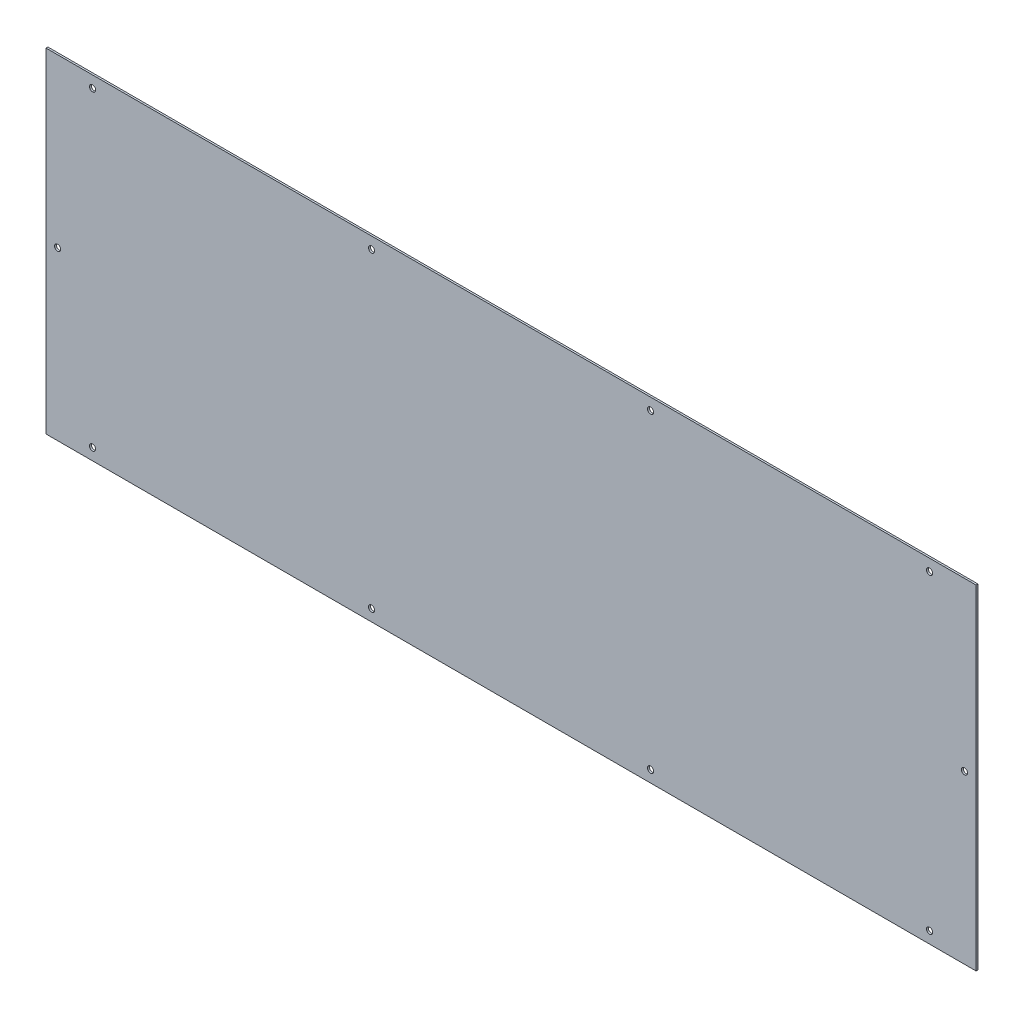
ISO-10303-21;
HEADER;
FILE_DESCRIPTION(('STEP AP214'),'2;1');
FILE_NAME('part.step','',(''),(''),'','','');
FILE_SCHEMA(('AUTOMOTIVE_DESIGN { 1 0 10303 214 1 1 1 1 }'));
ENDSEC;
DATA;
#1=APPLICATION_CONTEXT('core data for automotive mechanical design processes');
#2=APPLICATION_PROTOCOL_DEFINITION('international standard','automotive_design',2000,#1);
#3=PRODUCT_CONTEXT('',#1,'mechanical');
#4=PRODUCT('Part','Part','',(#3));
#5=PRODUCT_RELATED_PRODUCT_CATEGORY('part','',(#4));
#6=PRODUCT_DEFINITION_FORMATION('','',#4);
#7=PRODUCT_DEFINITION_CONTEXT('part definition',#1,'design');
#8=PRODUCT_DEFINITION('design','',#6,#7);
#9=PRODUCT_DEFINITION_SHAPE('','',#8);
#10=(LENGTH_UNIT() NAMED_UNIT(*) SI_UNIT(.MILLI.,.METRE.));
#11=(NAMED_UNIT(*) PLANE_ANGLE_UNIT() SI_UNIT($,.RADIAN.));
#12=(NAMED_UNIT(*) SI_UNIT($,.STERADIAN.) SOLID_ANGLE_UNIT());
#13=UNCERTAINTY_MEASURE_WITH_UNIT(LENGTH_MEASURE(1.E-05),#10,'distance_accuracy_value','');
#14=(GEOMETRIC_REPRESENTATION_CONTEXT(3) GLOBAL_UNCERTAINTY_ASSIGNED_CONTEXT((#13)) GLOBAL_UNIT_ASSIGNED_CONTEXT((#10,
#11,#12)) REPRESENTATION_CONTEXT('',''));
#15=CARTESIAN_POINT('',(0.,0.,0.));
#16=DIRECTION('',(0.,0.,1.));
#17=DIRECTION('',(1.,0.,0.));
#18=AXIS2_PLACEMENT_3D('',#15,#16,#17);
#19=CARTESIAN_POINT('',(0.,0.,2.));
#20=DIRECTION('',(0.,0.,-1.));
#21=DIRECTION('',(-1.,0.,0.));
#22=AXIS2_PLACEMENT_3D('',#19,#20,#21);
#23=PLANE('',#22);
#24=CARTESIAN_POINT('',(487.,0.,2.));
#25=DIRECTION('',(0.,0.,1.));
#26=DIRECTION('',(1.,0.,0.));
#27=AXIS2_PLACEMENT_3D('',#24,#25,#26);
#28=CIRCLE('',#27,3.29999999999997);
#29=CARTESIAN_POINT('',(490.3,0.,2.));
#30=VERTEX_POINT('',#29);
#31=EDGE_CURVE('E369',#30,#30,#28,.T.);
#32=ORIENTED_EDGE('',*,*,#31,.F.);
#33=EDGE_LOOP('',(#32));
#34=FACE_BOUND('',#33,.T.);
#35=CARTESIAN_POINT('',(-487.,0.,2.));
#36=DIRECTION('',(0.,0.,1.));
#37=DIRECTION('',(1.,0.,0.));
#38=AXIS2_PLACEMENT_3D('',#35,#36,#37);
#39=CIRCLE('',#38,3.29999999999997);
#40=CARTESIAN_POINT('',(-483.7,0.,2.));
#41=VERTEX_POINT('',#40);
#42=EDGE_CURVE('E145',#41,#41,#39,.T.);
#43=ORIENTED_EDGE('',*,*,#42,.F.);
#44=EDGE_LOOP('',(#43));
#45=FACE_BOUND('',#44,.T.);
#46=CARTESIAN_POINT('',(149.833333333333,-167.,2.));
#47=DIRECTION('',(0.,0.,1.));
#48=DIRECTION('',(1.,0.,0.));
#49=AXIS2_PLACEMENT_3D('',#46,#47,#48);
#50=CIRCLE('',#49,3.3);
#51=CARTESIAN_POINT('',(153.133333333333,-167.,2.));
#52=VERTEX_POINT('',#51);
#53=EDGE_CURVE('E142',#52,#52,#50,.T.);
#54=ORIENTED_EDGE('',*,*,#53,.F.);
#55=EDGE_LOOP('',(#54));
#56=FACE_BOUND('',#55,.T.);
#57=CARTESIAN_POINT('',(-149.833333333333,-167.,2.));
#58=DIRECTION('',(0.,0.,1.));
#59=DIRECTION('',(1.,0.,0.));
#60=AXIS2_PLACEMENT_3D('',#57,#58,#59);
#61=CIRCLE('',#60,3.3);
#62=CARTESIAN_POINT('',(-146.533333333333,-167.,2.));
#63=VERTEX_POINT('',#62);
#64=EDGE_CURVE('E154',#63,#63,#61,.T.);
#65=ORIENTED_EDGE('',*,*,#64,.F.);
#66=EDGE_LOOP('',(#65));
#67=FACE_BOUND('',#66,.T.);
#68=CARTESIAN_POINT('',(-449.5,-167.,2.));
#69=DIRECTION('',(0.,0.,1.));
#70=DIRECTION('',(1.,0.,0.));
#71=AXIS2_PLACEMENT_3D('',#68,#69,#70);
#72=CIRCLE('',#71,3.29999999999997);
#73=CARTESIAN_POINT('',(-446.2,-167.,2.));
#74=VERTEX_POINT('',#73);
#75=EDGE_CURVE('E160',#74,#74,#72,.T.);
#76=ORIENTED_EDGE('',*,*,#75,.F.);
#77=EDGE_LOOP('',(#76));
#78=FACE_BOUND('',#77,.T.);
#79=CARTESIAN_POINT('',(-149.833333333333,167.,2.));
#80=DIRECTION('',(0.,0.,1.));
#81=DIRECTION('',(1.,0.,0.));
#82=AXIS2_PLACEMENT_3D('',#79,#80,#81);
#83=CIRCLE('',#82,3.29999999999997);
#84=CARTESIAN_POINT('',(-146.533333333333,167.,2.));
#85=VERTEX_POINT('',#84);
#86=EDGE_CURVE('E169',#85,#85,#83,.T.);
#87=ORIENTED_EDGE('',*,*,#86,.F.);
#88=EDGE_LOOP('',(#87));
#89=FACE_BOUND('',#88,.T.);
#90=CARTESIAN_POINT('',(-449.5,167.,2.));
#91=DIRECTION('',(0.,0.,1.));
#92=DIRECTION('',(1.,0.,0.));
#93=AXIS2_PLACEMENT_3D('',#90,#91,#92);
#94=CIRCLE('',#93,3.29999999999997);
#95=CARTESIAN_POINT('',(-446.2,167.,2.));
#96=VERTEX_POINT('',#95);
#97=EDGE_CURVE('E172',#96,#96,#94,.T.);
#98=ORIENTED_EDGE('',*,*,#97,.F.);
#99=EDGE_LOOP('',(#98));
#100=FACE_BOUND('',#99,.T.);
#101=DIRECTION('',(0.,1.,0.));
#102=VECTOR('',#101,1.);
#103=CARTESIAN_POINT('',(499.5,-179.5,2.));
#104=LINE('',#103,#102);
#105=CARTESIAN_POINT('',(499.5,-179.5,2.));
#106=VERTEX_POINT('',#105);
#107=CARTESIAN_POINT('',(499.5,179.5,2.));
#108=VERTEX_POINT('',#107);
#109=EDGE_CURVE('E89',#106,#108,#104,.T.);
#110=ORIENTED_EDGE('',*,*,#109,.T.);
#111=DIRECTION('',(-1.,0.,0.));
#112=VECTOR('',#111,1.);
#113=CARTESIAN_POINT('',(-499.5,179.5,2.));
#114=LINE('',#113,#112);
#115=CARTESIAN_POINT('',(-499.5,179.5,2.));
#116=VERTEX_POINT('',#115);
#117=EDGE_CURVE('E84',#108,#116,#114,.T.);
#118=ORIENTED_EDGE('',*,*,#117,.T.);
#119=DIRECTION('',(0.,-1.,0.));
#120=VECTOR('',#119,1.);
#121=CARTESIAN_POINT('',(-499.5,-179.5,2.));
#122=LINE('',#121,#120);
#123=CARTESIAN_POINT('',(-499.5,-179.5,2.));
#124=VERTEX_POINT('',#123);
#125=EDGE_CURVE('E87',#116,#124,#122,.T.);
#126=ORIENTED_EDGE('',*,*,#125,.T.);
#127=DIRECTION('',(1.,0.,0.));
#128=VECTOR('',#127,1.);
#129=CARTESIAN_POINT('',(-499.5,-179.5,2.));
#130=LINE('',#129,#128);
#131=EDGE_CURVE('E53',#124,#106,#130,.T.);
#132=ORIENTED_EDGE('',*,*,#131,.T.);
#133=EDGE_LOOP('',(#110,#118,#126,#132));
#134=FACE_BOUND('',#133,.T.);
#135=CARTESIAN_POINT('',(149.833333333333,167.,2.));
#136=DIRECTION('',(0.,0.,1.));
#137=DIRECTION('',(1.,0.,0.));
#138=AXIS2_PLACEMENT_3D('',#135,#136,#137);
#139=CIRCLE('',#138,3.29999999999997);
#140=CARTESIAN_POINT('',(153.133333333333,167.,2.));
#141=VERTEX_POINT('',#140);
#142=EDGE_CURVE('E117',#141,#141,#139,.T.);
#143=ORIENTED_EDGE('',*,*,#142,.F.);
#144=EDGE_LOOP('',(#143));
#145=FACE_BOUND('',#144,.T.);
#146=CARTESIAN_POINT('',(449.5,167.,2.));
#147=DIRECTION('',(0.,0.,1.));
#148=DIRECTION('',(1.,0.,0.));
#149=AXIS2_PLACEMENT_3D('',#146,#147,#148);
#150=CIRCLE('',#149,3.29999999999997);
#151=CARTESIAN_POINT('',(452.8,167.,2.));
#152=VERTEX_POINT('',#151);
#153=EDGE_CURVE('E11',#152,#152,#150,.T.);
#154=ORIENTED_EDGE('',*,*,#153,.F.);
#155=EDGE_LOOP('',(#154));
#156=FACE_BOUND('',#155,.T.);
#157=CARTESIAN_POINT('',(449.5,-167.,2.));
#158=DIRECTION('',(0.,0.,1.));
#159=DIRECTION('',(1.,0.,0.));
#160=AXIS2_PLACEMENT_3D('',#157,#158,#159);
#161=CIRCLE('',#160,3.29999999999997);
#162=CARTESIAN_POINT('',(452.8,-167.,2.));
#163=VERTEX_POINT('',#162);
#164=EDGE_CURVE('E136',#163,#163,#161,.T.);
#165=ORIENTED_EDGE('',*,*,#164,.F.);
#166=EDGE_LOOP('',(#165));
#167=FACE_BOUND('',#166,.T.);
#168=ADVANCED_FACE('F36',(#34,#45,#56,#67,#78,#89,#100,#134,#145,#156,#167),#23,.F.);
#169=CARTESIAN_POINT('',(0.,0.,0.));
#170=DIRECTION('',(0.,0.,-1.));
#171=DIRECTION('',(-1.,0.,0.));
#172=AXIS2_PLACEMENT_3D('',#169,#170,#171);
#173=PLANE('',#172);
#174=CARTESIAN_POINT('',(487.,0.,0.));
#175=DIRECTION('',(0.,0.,1.));
#176=DIRECTION('',(1.,0.,0.));
#177=AXIS2_PLACEMENT_3D('',#174,#175,#176);
#178=CIRCLE('',#177,3.29999999999997);
#179=CARTESIAN_POINT('',(490.3,0.,0.));
#180=VERTEX_POINT('',#179);
#181=EDGE_CURVE('E366',#180,#180,#178,.T.);
#182=ORIENTED_EDGE('',*,*,#181,.T.);
#183=EDGE_LOOP('',(#182));
#184=FACE_BOUND('',#183,.T.);
#185=CARTESIAN_POINT('',(-487.,0.,0.));
#186=DIRECTION('',(0.,0.,1.));
#187=DIRECTION('',(1.,0.,0.));
#188=AXIS2_PLACEMENT_3D('',#185,#186,#187);
#189=CIRCLE('',#188,3.29999999999997);
#190=CARTESIAN_POINT('',(-483.7,0.,0.));
#191=VERTEX_POINT('',#190);
#192=EDGE_CURVE('E139',#191,#191,#189,.T.);
#193=ORIENTED_EDGE('',*,*,#192,.T.);
#194=EDGE_LOOP('',(#193));
#195=FACE_BOUND('',#194,.T.);
#196=CARTESIAN_POINT('',(449.5,-167.,0.));
#197=DIRECTION('',(0.,0.,1.));
#198=DIRECTION('',(1.,0.,0.));
#199=AXIS2_PLACEMENT_3D('',#196,#197,#198);
#200=CIRCLE('',#199,3.29999999999997);
#201=CARTESIAN_POINT('',(452.8,-167.,0.));
#202=VERTEX_POINT('',#201);
#203=EDGE_CURVE('E138',#202,#202,#200,.T.);
#204=ORIENTED_EDGE('',*,*,#203,.T.);
#205=EDGE_LOOP('',(#204));
#206=FACE_BOUND('',#205,.T.);
#207=CARTESIAN_POINT('',(449.5,167.,0.));
#208=DIRECTION('',(0.,0.,1.));
#209=DIRECTION('',(1.,0.,0.));
#210=AXIS2_PLACEMENT_3D('',#207,#208,#209);
#211=CIRCLE('',#210,3.29999999999997);
#212=CARTESIAN_POINT('',(452.8,167.,0.));
#213=VERTEX_POINT('',#212);
#214=EDGE_CURVE('E45',#213,#213,#211,.T.);
#215=ORIENTED_EDGE('',*,*,#214,.T.);
#216=EDGE_LOOP('',(#215));
#217=FACE_BOUND('',#216,.T.);
#218=CARTESIAN_POINT('',(149.833333333333,167.,0.));
#219=DIRECTION('',(0.,0.,1.));
#220=DIRECTION('',(1.,0.,0.));
#221=AXIS2_PLACEMENT_3D('',#218,#219,#220);
#222=CIRCLE('',#221,3.29999999999997);
#223=CARTESIAN_POINT('',(153.133333333333,167.,0.));
#224=VERTEX_POINT('',#223);
#225=EDGE_CURVE('E114',#224,#224,#222,.T.);
#226=ORIENTED_EDGE('',*,*,#225,.T.);
#227=EDGE_LOOP('',(#226));
#228=FACE_BOUND('',#227,.T.);
#229=DIRECTION('',(0.,1.,0.));
#230=VECTOR('',#229,1.);
#231=CARTESIAN_POINT('',(499.5,-179.5,0.));
#232=LINE('',#231,#230);
#233=CARTESIAN_POINT('',(499.5,-179.5,0.));
#234=VERTEX_POINT('',#233);
#235=CARTESIAN_POINT('',(499.5,179.5,0.));
#236=VERTEX_POINT('',#235);
#237=EDGE_CURVE('E104',#234,#236,#232,.T.);
#238=ORIENTED_EDGE('',*,*,#237,.F.);
#239=DIRECTION('',(1.,0.,0.));
#240=VECTOR('',#239,1.);
#241=CARTESIAN_POINT('',(-499.5,-179.5,0.));
#242=LINE('',#241,#240);
#243=CARTESIAN_POINT('',(-499.5,-179.5,0.));
#244=VERTEX_POINT('',#243);
#245=EDGE_CURVE('E76',#244,#234,#242,.T.);
#246=ORIENTED_EDGE('',*,*,#245,.F.);
#247=DIRECTION('',(0.,-1.,0.));
#248=VECTOR('',#247,1.);
#249=CARTESIAN_POINT('',(-499.5,-179.5,0.));
#250=LINE('',#249,#248);
#251=CARTESIAN_POINT('',(-499.5,179.5,0.));
#252=VERTEX_POINT('',#251);
#253=EDGE_CURVE('E70',#252,#244,#250,.T.);
#254=ORIENTED_EDGE('',*,*,#253,.F.);
#255=DIRECTION('',(-1.,0.,0.));
#256=VECTOR('',#255,1.);
#257=CARTESIAN_POINT('',(-499.5,179.5,0.));
#258=LINE('',#257,#256);
#259=EDGE_CURVE('E94',#236,#252,#258,.T.);
#260=ORIENTED_EDGE('',*,*,#259,.F.);
#261=EDGE_LOOP('',(#238,#246,#254,#260));
#262=FACE_BOUND('',#261,.T.);
#263=CARTESIAN_POINT('',(-449.5,167.,0.));
#264=DIRECTION('',(0.,0.,1.));
#265=DIRECTION('',(1.,0.,0.));
#266=AXIS2_PLACEMENT_3D('',#263,#264,#265);
#267=CIRCLE('',#266,3.29999999999997);
#268=CARTESIAN_POINT('',(-446.2,167.,0.));
#269=VERTEX_POINT('',#268);
#270=EDGE_CURVE('E107',#269,#269,#267,.T.);
#271=ORIENTED_EDGE('',*,*,#270,.T.);
#272=EDGE_LOOP('',(#271));
#273=FACE_BOUND('',#272,.T.);
#274=CARTESIAN_POINT('',(-149.833333333333,167.,0.));
#275=DIRECTION('',(0.,0.,1.));
#276=DIRECTION('',(1.,0.,0.));
#277=AXIS2_PLACEMENT_3D('',#274,#275,#276);
#278=CIRCLE('',#277,3.29999999999997);
#279=CARTESIAN_POINT('',(-146.533333333333,167.,0.));
#280=VERTEX_POINT('',#279);
#281=EDGE_CURVE('E166',#280,#280,#278,.T.);
#282=ORIENTED_EDGE('',*,*,#281,.T.);
#283=EDGE_LOOP('',(#282));
#284=FACE_BOUND('',#283,.T.);
#285=CARTESIAN_POINT('',(-449.5,-167.,0.));
#286=DIRECTION('',(0.,0.,1.));
#287=DIRECTION('',(1.,0.,0.));
#288=AXIS2_PLACEMENT_3D('',#285,#286,#287);
#289=CIRCLE('',#288,3.29999999999997);
#290=CARTESIAN_POINT('',(-446.2,-167.,0.));
#291=VERTEX_POINT('',#290);
#292=EDGE_CURVE('E163',#291,#291,#289,.T.);
#293=ORIENTED_EDGE('',*,*,#292,.T.);
#294=EDGE_LOOP('',(#293));
#295=FACE_BOUND('',#294,.T.);
#296=CARTESIAN_POINT('',(-149.833333333333,-167.,0.));
#297=DIRECTION('',(0.,0.,1.));
#298=DIRECTION('',(1.,0.,0.));
#299=AXIS2_PLACEMENT_3D('',#296,#297,#298);
#300=CIRCLE('',#299,3.3);
#301=CARTESIAN_POINT('',(-146.533333333333,-167.,0.));
#302=VERTEX_POINT('',#301);
#303=EDGE_CURVE('E157',#302,#302,#300,.T.);
#304=ORIENTED_EDGE('',*,*,#303,.T.);
#305=EDGE_LOOP('',(#304));
#306=FACE_BOUND('',#305,.T.);
#307=CARTESIAN_POINT('',(149.833333333333,-167.,0.));
#308=DIRECTION('',(0.,0.,1.));
#309=DIRECTION('',(1.,0.,0.));
#310=AXIS2_PLACEMENT_3D('',#307,#308,#309);
#311=CIRCLE('',#310,3.3);
#312=CARTESIAN_POINT('',(153.133333333333,-167.,0.));
#313=VERTEX_POINT('',#312);
#314=EDGE_CURVE('E151',#313,#313,#311,.T.);
#315=ORIENTED_EDGE('',*,*,#314,.T.);
#316=EDGE_LOOP('',(#315));
#317=FACE_BOUND('',#316,.T.);
#318=ADVANCED_FACE('F122',(#184,#195,#206,#217,#228,#262,#273,#284,#295,#306,#317),#173,.T.);
#319=CARTESIAN_POINT('',(449.5,167.,2.));
#320=DIRECTION('',(0.,0.,1.));
#321=DIRECTION('',(1.,0.,0.));
#322=AXIS2_PLACEMENT_3D('',#319,#320,#321);
#323=CYLINDRICAL_SURFACE('',#322,3.29999999999997);
#324=ORIENTED_EDGE('',*,*,#214,.F.);
#325=EDGE_LOOP('',(#324));
#326=FACE_BOUND('',#325,.T.);
#327=ORIENTED_EDGE('',*,*,#153,.T.);
#328=EDGE_LOOP('',(#327));
#329=FACE_BOUND('',#328,.T.);
#330=ADVANCED_FACE('F38',(#326,#329),#323,.F.);
#331=CARTESIAN_POINT('',(149.833333333333,167.,2.));
#332=DIRECTION('',(0.,0.,1.));
#333=DIRECTION('',(1.,0.,0.));
#334=AXIS2_PLACEMENT_3D('',#331,#332,#333);
#335=CYLINDRICAL_SURFACE('',#334,3.29999999999997);
#336=ORIENTED_EDGE('',*,*,#225,.F.);
#337=EDGE_LOOP('',(#336));
#338=FACE_BOUND('',#337,.T.);
#339=ORIENTED_EDGE('',*,*,#142,.T.);
#340=EDGE_LOOP('',(#339));
#341=FACE_BOUND('',#340,.T.);
#342=ADVANCED_FACE('F127',(#338,#341),#335,.F.);
#343=CARTESIAN_POINT('',(499.5,-179.5,2.));
#344=DIRECTION('',(-1.,0.,0.));
#345=DIRECTION('',(0.,0.,1.));
#346=AXIS2_PLACEMENT_3D('',#343,#344,#345);
#347=PLANE('',#346);
#348=ORIENTED_EDGE('',*,*,#237,.T.);
#349=DIRECTION('',(0.,0.,-1.));
#350=VECTOR('',#349,1.);
#351=CARTESIAN_POINT('',(499.5,179.5,2.));
#352=LINE('',#351,#350);
#353=EDGE_CURVE('E95',#108,#236,#352,.T.);
#354=ORIENTED_EDGE('',*,*,#353,.F.);
#355=ORIENTED_EDGE('',*,*,#109,.F.);
#356=DIRECTION('',(0.,0.,-1.));
#357=VECTOR('',#356,1.);
#358=CARTESIAN_POINT('',(499.5,-179.5,2.));
#359=LINE('',#358,#357);
#360=EDGE_CURVE('E100',#106,#234,#359,.T.);
#361=ORIENTED_EDGE('',*,*,#360,.T.);
#362=EDGE_LOOP('',(#348,#354,#355,#361));
#363=FACE_BOUND('',#362,.T.);
#364=ADVANCED_FACE('F205',(#363),#347,.F.);
#365=CARTESIAN_POINT('',(-499.5,179.5,2.));
#366=DIRECTION('',(0.,-1.,0.));
#367=DIRECTION('',(0.,0.,-1.));
#368=AXIS2_PLACEMENT_3D('',#365,#366,#367);
#369=PLANE('',#368);
#370=ORIENTED_EDGE('',*,*,#259,.T.);
#371=DIRECTION('',(0.,0.,-1.));
#372=VECTOR('',#371,1.);
#373=CARTESIAN_POINT('',(-499.5,179.5,2.));
#374=LINE('',#373,#372);
#375=EDGE_CURVE('E92',#116,#252,#374,.T.);
#376=ORIENTED_EDGE('',*,*,#375,.F.);
#377=ORIENTED_EDGE('',*,*,#117,.F.);
#378=ORIENTED_EDGE('',*,*,#353,.T.);
#379=EDGE_LOOP('',(#370,#376,#377,#378));
#380=FACE_BOUND('',#379,.T.);
#381=ADVANCED_FACE('F93',(#380),#369,.F.);
#382=CARTESIAN_POINT('',(-499.5,-179.5,2.));
#383=DIRECTION('',(1.,0.,0.));
#384=DIRECTION('',(0.,0.,-1.));
#385=AXIS2_PLACEMENT_3D('',#382,#383,#384);
#386=PLANE('',#385);
#387=ORIENTED_EDGE('',*,*,#253,.T.);
#388=DIRECTION('',(0.,0.,-1.));
#389=VECTOR('',#388,1.);
#390=CARTESIAN_POINT('',(-499.5,-179.5,2.));
#391=LINE('',#390,#389);
#392=EDGE_CURVE('E96',#124,#244,#391,.T.);
#393=ORIENTED_EDGE('',*,*,#392,.F.);
#394=ORIENTED_EDGE('',*,*,#125,.F.);
#395=ORIENTED_EDGE('',*,*,#375,.T.);
#396=EDGE_LOOP('',(#387,#393,#394,#395));
#397=FACE_BOUND('',#396,.T.);
#398=ADVANCED_FACE('F98',(#397),#386,.F.);
#399=CARTESIAN_POINT('',(-499.5,-179.5,2.));
#400=DIRECTION('',(0.,1.,0.));
#401=DIRECTION('',(0.,0.,1.));
#402=AXIS2_PLACEMENT_3D('',#399,#400,#401);
#403=PLANE('',#402);
#404=ORIENTED_EDGE('',*,*,#245,.T.);
#405=ORIENTED_EDGE('',*,*,#360,.F.);
#406=ORIENTED_EDGE('',*,*,#131,.F.);
#407=ORIENTED_EDGE('',*,*,#392,.T.);
#408=EDGE_LOOP('',(#404,#405,#406,#407));
#409=FACE_BOUND('',#408,.T.);
#410=ADVANCED_FACE('F184',(#409),#403,.F.);
#411=CARTESIAN_POINT('',(-449.5,167.,2.));
#412=DIRECTION('',(0.,0.,1.));
#413=DIRECTION('',(1.,0.,0.));
#414=AXIS2_PLACEMENT_3D('',#411,#412,#413);
#415=CYLINDRICAL_SURFACE('',#414,3.29999999999997);
#416=ORIENTED_EDGE('',*,*,#270,.F.);
#417=EDGE_LOOP('',(#416));
#418=FACE_BOUND('',#417,.T.);
#419=ORIENTED_EDGE('',*,*,#97,.T.);
#420=EDGE_LOOP('',(#419));
#421=FACE_BOUND('',#420,.T.);
#422=ADVANCED_FACE('F180',(#418,#421),#415,.F.);
#423=CARTESIAN_POINT('',(-149.833333333333,167.,2.));
#424=DIRECTION('',(0.,0.,1.));
#425=DIRECTION('',(1.,0.,0.));
#426=AXIS2_PLACEMENT_3D('',#423,#424,#425);
#427=CYLINDRICAL_SURFACE('',#426,3.29999999999997);
#428=ORIENTED_EDGE('',*,*,#281,.F.);
#429=EDGE_LOOP('',(#428));
#430=FACE_BOUND('',#429,.T.);
#431=ORIENTED_EDGE('',*,*,#86,.T.);
#432=EDGE_LOOP('',(#431));
#433=FACE_BOUND('',#432,.T.);
#434=ADVANCED_FACE('F183',(#430,#433),#427,.F.);
#435=CARTESIAN_POINT('',(-449.5,-167.,2.));
#436=DIRECTION('',(0.,0.,1.));
#437=DIRECTION('',(1.,0.,0.));
#438=AXIS2_PLACEMENT_3D('',#435,#436,#437);
#439=CYLINDRICAL_SURFACE('',#438,3.29999999999997);
#440=ORIENTED_EDGE('',*,*,#292,.F.);
#441=EDGE_LOOP('',(#440));
#442=FACE_BOUND('',#441,.T.);
#443=ORIENTED_EDGE('',*,*,#75,.T.);
#444=EDGE_LOOP('',(#443));
#445=FACE_BOUND('',#444,.T.);
#446=ADVANCED_FACE('F192',(#442,#445),#439,.F.);
#447=CARTESIAN_POINT('',(-149.833333333333,-167.,2.));
#448=DIRECTION('',(0.,0.,1.));
#449=DIRECTION('',(1.,0.,0.));
#450=AXIS2_PLACEMENT_3D('',#447,#448,#449);
#451=CYLINDRICAL_SURFACE('',#450,3.3);
#452=ORIENTED_EDGE('',*,*,#303,.F.);
#453=EDGE_LOOP('',(#452));
#454=FACE_BOUND('',#453,.T.);
#455=ORIENTED_EDGE('',*,*,#64,.T.);
#456=EDGE_LOOP('',(#455));
#457=FACE_BOUND('',#456,.T.);
#458=ADVANCED_FACE('F255',(#454,#457),#451,.F.);
#459=CARTESIAN_POINT('',(149.833333333333,-167.,2.));
#460=DIRECTION('',(0.,0.,1.));
#461=DIRECTION('',(1.,0.,0.));
#462=AXIS2_PLACEMENT_3D('',#459,#460,#461);
#463=CYLINDRICAL_SURFACE('',#462,3.3);
#464=ORIENTED_EDGE('',*,*,#314,.F.);
#465=EDGE_LOOP('',(#464));
#466=FACE_BOUND('',#465,.T.);
#467=ORIENTED_EDGE('',*,*,#53,.T.);
#468=EDGE_LOOP('',(#467));
#469=FACE_BOUND('',#468,.T.);
#470=ADVANCED_FACE('F264',(#466,#469),#463,.F.);
#471=CARTESIAN_POINT('',(449.5,-167.,2.));
#472=DIRECTION('',(0.,0.,1.));
#473=DIRECTION('',(1.,0.,0.));
#474=AXIS2_PLACEMENT_3D('',#471,#472,#473);
#475=CYLINDRICAL_SURFACE('',#474,3.29999999999997);
#476=ORIENTED_EDGE('',*,*,#203,.F.);
#477=EDGE_LOOP('',(#476));
#478=FACE_BOUND('',#477,.T.);
#479=ORIENTED_EDGE('',*,*,#164,.T.);
#480=EDGE_LOOP('',(#479));
#481=FACE_BOUND('',#480,.T.);
#482=ADVANCED_FACE('F274',(#478,#481),#475,.F.);
#483=CARTESIAN_POINT('',(-487.,0.,2.));
#484=DIRECTION('',(0.,0.,1.));
#485=DIRECTION('',(1.,0.,0.));
#486=AXIS2_PLACEMENT_3D('',#483,#484,#485);
#487=CYLINDRICAL_SURFACE('',#486,3.29999999999997);
#488=ORIENTED_EDGE('',*,*,#192,.F.);
#489=EDGE_LOOP('',(#488));
#490=FACE_BOUND('',#489,.T.);
#491=ORIENTED_EDGE('',*,*,#42,.T.);
#492=EDGE_LOOP('',(#491));
#493=FACE_BOUND('',#492,.T.);
#494=ADVANCED_FACE('F284',(#490,#493),#487,.F.);
#495=CARTESIAN_POINT('',(487.,0.,2.));
#496=DIRECTION('',(0.,0.,1.));
#497=DIRECTION('',(1.,0.,0.));
#498=AXIS2_PLACEMENT_3D('',#495,#496,#497);
#499=CYLINDRICAL_SURFACE('',#498,3.29999999999997);
#500=ORIENTED_EDGE('',*,*,#181,.F.);
#501=EDGE_LOOP('',(#500));
#502=FACE_BOUND('',#501,.T.);
#503=ORIENTED_EDGE('',*,*,#31,.T.);
#504=EDGE_LOOP('',(#503));
#505=FACE_BOUND('',#504,.T.);
#506=ADVANCED_FACE('F294',(#502,#505),#499,.F.);
#507=CLOSED_SHELL('',(#168,#318,#330,#342,#364,#381,#398,#410,#422,#434,#446,#458,#470,#482,
#494,#506));
#508=MANIFOLD_SOLID_BREP('B2',#507);
#509=ADVANCED_BREP_SHAPE_REPRESENTATION('',(#18,#508),#14);
#510=SHAPE_DEFINITION_REPRESENTATION(#9,#509);
ENDSEC;
END-ISO-10303-21;
